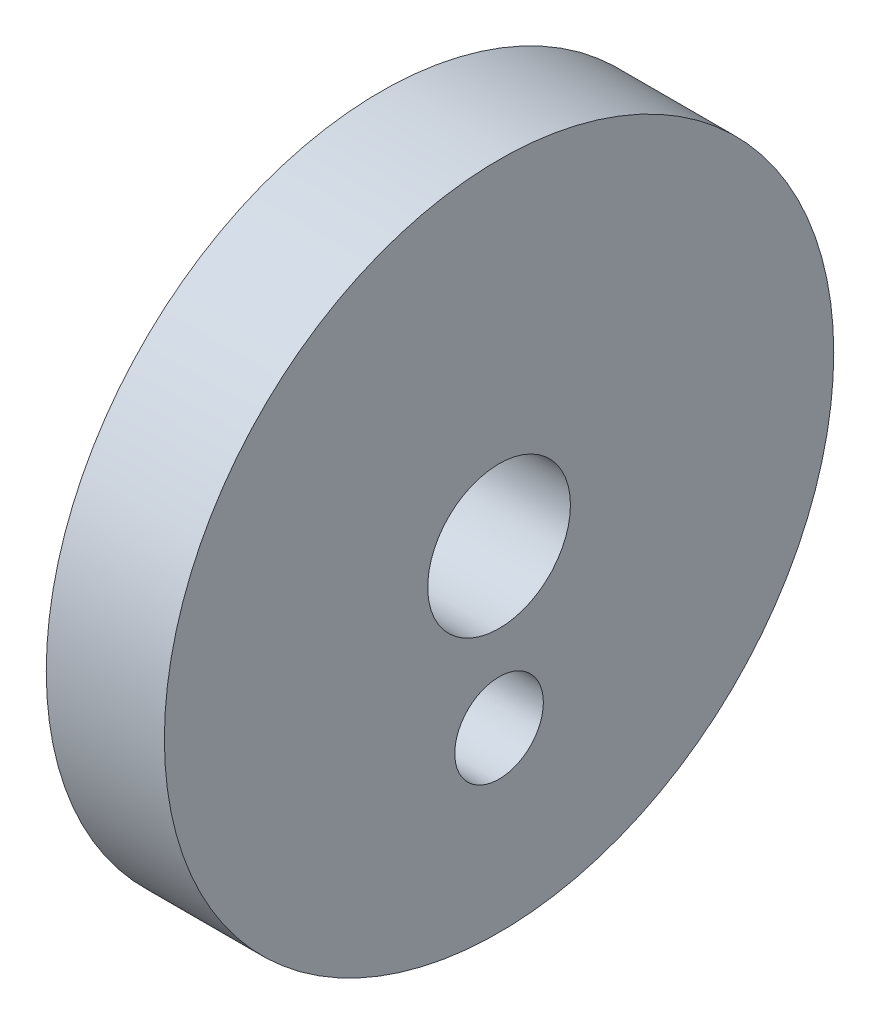
ISO-10303-21;
HEADER;
FILE_DESCRIPTION(('STEP AP214'),'2;1');
FILE_NAME('part.step','',(''),(''),'','','');
FILE_SCHEMA(('AUTOMOTIVE_DESIGN { 1 0 10303 214 1 1 1 1 }'));
ENDSEC;
DATA;
#1=APPLICATION_CONTEXT('core data for automotive mechanical design processes');
#2=APPLICATION_PROTOCOL_DEFINITION('international standard','automotive_design',2000,#1);
#3=PRODUCT_CONTEXT('',#1,'mechanical');
#4=PRODUCT('Part','Part','',(#3));
#5=PRODUCT_RELATED_PRODUCT_CATEGORY('part','',(#4));
#6=PRODUCT_DEFINITION_FORMATION('','',#4);
#7=PRODUCT_DEFINITION_CONTEXT('part definition',#1,'design');
#8=PRODUCT_DEFINITION('design','',#6,#7);
#9=PRODUCT_DEFINITION_SHAPE('','',#8);
#10=(LENGTH_UNIT() NAMED_UNIT(*) SI_UNIT(.MILLI.,.METRE.));
#11=(NAMED_UNIT(*) PLANE_ANGLE_UNIT() SI_UNIT($,.RADIAN.));
#12=(NAMED_UNIT(*) SI_UNIT($,.STERADIAN.) SOLID_ANGLE_UNIT());
#13=UNCERTAINTY_MEASURE_WITH_UNIT(LENGTH_MEASURE(1.E-05),#10,'distance_accuracy_value','');
#14=(GEOMETRIC_REPRESENTATION_CONTEXT(3) GLOBAL_UNCERTAINTY_ASSIGNED_CONTEXT((#13)) GLOBAL_UNIT_ASSIGNED_CONTEXT((#10,
#11,#12)) REPRESENTATION_CONTEXT('',''));
#15=CARTESIAN_POINT('',(0.,0.,0.));
#16=DIRECTION('',(0.,0.,1.));
#17=DIRECTION('',(1.,0.,0.));
#18=AXIS2_PLACEMENT_3D('',#15,#16,#17);
#19=CARTESIAN_POINT('',(12.,0.,0.));
#20=DIRECTION('',(-1.,0.,0.));
#21=DIRECTION('',(0.,0.,1.));
#22=AXIS2_PLACEMENT_3D('',#19,#20,#21);
#23=CYLINDRICAL_SURFACE('',#22,34.);
#24=CARTESIAN_POINT('',(12.,0.,0.));
#25=DIRECTION('',(1.,0.,0.));
#26=DIRECTION('',(0.,0.,-1.));
#27=AXIS2_PLACEMENT_3D('',#24,#25,#26);
#28=CIRCLE('',#27,34.);
#29=CARTESIAN_POINT('',(12.,0.,-34.));
#30=VERTEX_POINT('',#29);
#31=EDGE_CURVE('E10',#30,#30,#28,.T.);
#32=ORIENTED_EDGE('',*,*,#31,.F.);
#33=EDGE_LOOP('',(#32));
#34=FACE_BOUND('',#33,.T.);
#35=CARTESIAN_POINT('',(0.,0.,0.));
#36=DIRECTION('',(1.,0.,0.));
#37=DIRECTION('',(0.,0.,-1.));
#38=AXIS2_PLACEMENT_3D('',#35,#36,#37);
#39=CIRCLE('',#38,34.);
#40=CARTESIAN_POINT('',(0.,0.,-34.));
#41=VERTEX_POINT('',#40);
#42=EDGE_CURVE('E46',#41,#41,#39,.T.);
#43=ORIENTED_EDGE('',*,*,#42,.T.);
#44=EDGE_LOOP('',(#43));
#45=FACE_BOUND('',#44,.T.);
#46=ADVANCED_FACE('F43',(#34,#45),#23,.T.);
#47=CARTESIAN_POINT('',(12.,0.,0.));
#48=DIRECTION('',(1.,0.,0.));
#49=DIRECTION('',(0.,0.,-1.));
#50=AXIS2_PLACEMENT_3D('',#47,#48,#49);
#51=PLANE('',#50);
#52=CARTESIAN_POINT('',(12.,-16.,0.));
#53=DIRECTION('',(1.,0.,0.));
#54=DIRECTION('',(0.,0.,-1.));
#55=AXIS2_PLACEMENT_3D('',#52,#53,#54);
#56=CIRCLE('',#55,4.5);
#57=CARTESIAN_POINT('',(12.,-16.,-4.5));
#58=VERTEX_POINT('',#57);
#59=EDGE_CURVE('E68',#58,#58,#56,.T.);
#60=ORIENTED_EDGE('',*,*,#59,.F.);
#61=EDGE_LOOP('',(#60));
#62=FACE_BOUND('',#61,.T.);
#63=CARTESIAN_POINT('',(12.,0.,0.));
#64=DIRECTION('',(1.,0.,0.));
#65=DIRECTION('',(0.,0.,-1.));
#66=AXIS2_PLACEMENT_3D('',#63,#64,#65);
#67=CIRCLE('',#66,7.25);
#68=CARTESIAN_POINT('',(12.,0.,-7.25));
#69=VERTEX_POINT('',#68);
#70=EDGE_CURVE('E60',#69,#69,#67,.T.);
#71=ORIENTED_EDGE('',*,*,#70,.F.);
#72=EDGE_LOOP('',(#71));
#73=FACE_BOUND('',#72,.T.);
#74=ORIENTED_EDGE('',*,*,#31,.T.);
#75=EDGE_LOOP('',(#74));
#76=FACE_BOUND('',#75,.T.);
#77=ADVANCED_FACE('F76',(#62,#73,#76),#51,.T.);
#78=CARTESIAN_POINT('',(0.,0.,0.));
#79=DIRECTION('',(1.,0.,0.));
#80=DIRECTION('',(0.,0.,-1.));
#81=AXIS2_PLACEMENT_3D('',#78,#79,#80);
#82=PLANE('',#81);
#83=CARTESIAN_POINT('',(0.,-16.,0.));
#84=DIRECTION('',(1.,0.,0.));
#85=DIRECTION('',(0.,0.,-1.));
#86=AXIS2_PLACEMENT_3D('',#83,#84,#85);
#87=CIRCLE('',#86,4.5);
#88=CARTESIAN_POINT('',(0.,-16.,-4.5));
#89=VERTEX_POINT('',#88);
#90=EDGE_CURVE('E64',#89,#89,#87,.T.);
#91=ORIENTED_EDGE('',*,*,#90,.T.);
#92=EDGE_LOOP('',(#91));
#93=FACE_BOUND('',#92,.T.);
#94=CARTESIAN_POINT('',(0.,0.,0.));
#95=DIRECTION('',(1.,0.,0.));
#96=DIRECTION('',(0.,0.,-1.));
#97=AXIS2_PLACEMENT_3D('',#94,#95,#96);
#98=CIRCLE('',#97,7.25);
#99=CARTESIAN_POINT('',(0.,0.,-7.25));
#100=VERTEX_POINT('',#99);
#101=EDGE_CURVE('E55',#100,#100,#98,.T.);
#102=ORIENTED_EDGE('',*,*,#101,.T.);
#103=EDGE_LOOP('',(#102));
#104=FACE_BOUND('',#103,.T.);
#105=ORIENTED_EDGE('',*,*,#42,.F.);
#106=EDGE_LOOP('',(#105));
#107=FACE_BOUND('',#106,.T.);
#108=ADVANCED_FACE('F79',(#93,#104,#107),#82,.F.);
#109=CARTESIAN_POINT('',(12.,0.,0.));
#110=DIRECTION('',(1.,0.,0.));
#111=DIRECTION('',(0.,0.,-1.));
#112=AXIS2_PLACEMENT_3D('',#109,#110,#111);
#113=CYLINDRICAL_SURFACE('',#112,7.25);
#114=ORIENTED_EDGE('',*,*,#70,.T.);
#115=EDGE_LOOP('',(#114));
#116=FACE_BOUND('',#115,.T.);
#117=ORIENTED_EDGE('',*,*,#101,.F.);
#118=EDGE_LOOP('',(#117));
#119=FACE_BOUND('',#118,.T.);
#120=ADVANCED_FACE('F83',(#116,#119),#113,.F.);
#121=CARTESIAN_POINT('',(12.,-16.,0.));
#122=DIRECTION('',(1.,0.,0.));
#123=DIRECTION('',(0.,0.,-1.));
#124=AXIS2_PLACEMENT_3D('',#121,#122,#123);
#125=CYLINDRICAL_SURFACE('',#124,4.5);
#126=ORIENTED_EDGE('',*,*,#59,.T.);
#127=EDGE_LOOP('',(#126));
#128=FACE_BOUND('',#127,.T.);
#129=ORIENTED_EDGE('',*,*,#90,.F.);
#130=EDGE_LOOP('',(#129));
#131=FACE_BOUND('',#130,.T.);
#132=ADVANCED_FACE('F73',(#128,#131),#125,.F.);
#133=CLOSED_SHELL('',(#46,#77,#108,#120,#132));
#134=MANIFOLD_SOLID_BREP('B2',#133);
#135=ADVANCED_BREP_SHAPE_REPRESENTATION('',(#18,#134),#14);
#136=SHAPE_DEFINITION_REPRESENTATION(#9,#135);
ENDSEC;
END-ISO-10303-21;
